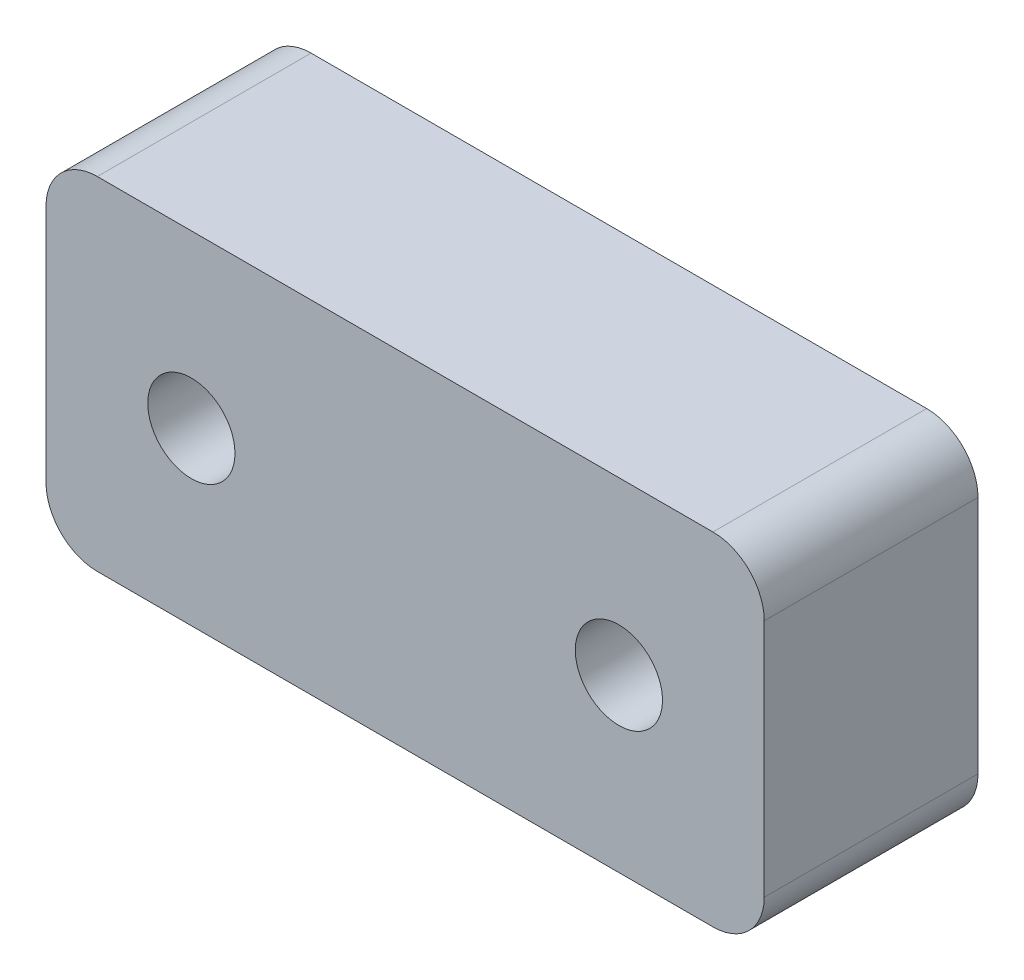
ISO-10303-21;
HEADER;
FILE_DESCRIPTION(('STEP AP214'),'2;1');
FILE_NAME('part.step','',(''),(''),'','','');
FILE_SCHEMA(('AUTOMOTIVE_DESIGN { 1 0 10303 214 1 1 1 1 }'));
ENDSEC;
DATA;
#1=APPLICATION_CONTEXT('core data for automotive mechanical design processes');
#2=APPLICATION_PROTOCOL_DEFINITION('international standard','automotive_design',2000,#1);
#3=PRODUCT_CONTEXT('',#1,'mechanical');
#4=PRODUCT('Part','Part','',(#3));
#5=PRODUCT_RELATED_PRODUCT_CATEGORY('part','',(#4));
#6=PRODUCT_DEFINITION_FORMATION('','',#4);
#7=PRODUCT_DEFINITION_CONTEXT('part definition',#1,'design');
#8=PRODUCT_DEFINITION('design','',#6,#7);
#9=PRODUCT_DEFINITION_SHAPE('','',#8);
#10=(LENGTH_UNIT() NAMED_UNIT(*) SI_UNIT(.MILLI.,.METRE.));
#11=(NAMED_UNIT(*) PLANE_ANGLE_UNIT() SI_UNIT($,.RADIAN.));
#12=(NAMED_UNIT(*) SI_UNIT($,.STERADIAN.) SOLID_ANGLE_UNIT());
#13=UNCERTAINTY_MEASURE_WITH_UNIT(LENGTH_MEASURE(1.E-05),#10,'distance_accuracy_value','');
#14=(GEOMETRIC_REPRESENTATION_CONTEXT(3) GLOBAL_UNCERTAINTY_ASSIGNED_CONTEXT((#13)) GLOBAL_UNIT_ASSIGNED_CONTEXT((#10,
#11,#12)) REPRESENTATION_CONTEXT('',''));
#15=CARTESIAN_POINT('',(0.,0.,0.));
#16=DIRECTION('',(0.,0.,1.));
#17=DIRECTION('',(1.,0.,0.));
#18=AXIS2_PLACEMENT_3D('',#15,#16,#17);
#19=CARTESIAN_POINT('',(-21.,-10.,12.5));
#20=DIRECTION('',(1.,0.,0.));
#21=DIRECTION('',(0.,0.,-1.));
#22=AXIS2_PLACEMENT_3D('',#19,#20,#21);
#23=PLANE('',#22);
#24=DIRECTION('',(0.,-1.,0.));
#25=VECTOR('',#24,1.);
#26=CARTESIAN_POINT('',(-21.,-10.,12.5));
#27=LINE('',#26,#25);
#28=CARTESIAN_POINT('',(-21.,7.,12.5));
#29=VERTEX_POINT('',#28);
#30=CARTESIAN_POINT('',(-21.,-7.,12.5));
#31=VERTEX_POINT('',#30);
#32=EDGE_CURVE('E133',#29,#31,#27,.T.);
#33=ORIENTED_EDGE('',*,*,#32,.F.);
#34=DIRECTION('',(0.,0.,-1.));
#35=VECTOR('',#34,1.);
#36=CARTESIAN_POINT('',(-21.,7.,12.5));
#37=LINE('',#36,#35);
#38=CARTESIAN_POINT('',(-21.,7.,0.));
#39=VERTEX_POINT('',#38);
#40=EDGE_CURVE('E11',#29,#39,#37,.T.);
#41=ORIENTED_EDGE('',*,*,#40,.T.);
#42=DIRECTION('',(0.,-1.,0.));
#43=VECTOR('',#42,1.);
#44=CARTESIAN_POINT('',(-21.,-10.,0.));
#45=LINE('',#44,#43);
#46=CARTESIAN_POINT('',(-21.,-7.,0.));
#47=VERTEX_POINT('',#46);
#48=EDGE_CURVE('E164',#39,#47,#45,.T.);
#49=ORIENTED_EDGE('',*,*,#48,.T.);
#50=DIRECTION('',(0.,0.,-1.));
#51=VECTOR('',#50,1.);
#52=CARTESIAN_POINT('',(-21.,-7.,12.5));
#53=LINE('',#52,#51);
#54=EDGE_CURVE('E47',#47,#31,#53,.F.);
#55=ORIENTED_EDGE('',*,*,#54,.T.);
#56=EDGE_LOOP('',(#33,#41,#49,#55));
#57=FACE_BOUND('',#56,.T.);
#58=ADVANCED_FACE('F39',(#57),#23,.F.);
#59=CARTESIAN_POINT('',(21.,-10.,12.5));
#60=DIRECTION('',(0.,1.,0.));
#61=DIRECTION('',(-1.,0.,0.));
#62=AXIS2_PLACEMENT_3D('',#59,#60,#61);
#63=PLANE('',#62);
#64=DIRECTION('',(1.,0.,0.));
#65=VECTOR('',#64,1.);
#66=CARTESIAN_POINT('',(21.,-10.,0.));
#67=LINE('',#66,#65);
#68=CARTESIAN_POINT('',(-18.,-10.,0.));
#69=VERTEX_POINT('',#68);
#70=CARTESIAN_POINT('',(18.,-10.,0.));
#71=VERTEX_POINT('',#70);
#72=EDGE_CURVE('E138',#69,#71,#67,.T.);
#73=ORIENTED_EDGE('',*,*,#72,.T.);
#74=DIRECTION('',(0.,0.,-1.));
#75=VECTOR('',#74,1.);
#76=CARTESIAN_POINT('',(18.,-10.,12.5));
#77=LINE('',#76,#75);
#78=CARTESIAN_POINT('',(18.,-10.,12.5));
#79=VERTEX_POINT('',#78);
#80=EDGE_CURVE('E54',#71,#79,#77,.F.);
#81=ORIENTED_EDGE('',*,*,#80,.T.);
#82=DIRECTION('',(1.,0.,0.));
#83=VECTOR('',#82,1.);
#84=CARTESIAN_POINT('',(21.,-10.,12.5));
#85=LINE('',#84,#83);
#86=CARTESIAN_POINT('',(-18.,-10.,12.5));
#87=VERTEX_POINT('',#86);
#88=EDGE_CURVE('E136',#87,#79,#85,.T.);
#89=ORIENTED_EDGE('',*,*,#88,.F.);
#90=DIRECTION('',(0.,0.,-1.));
#91=VECTOR('',#90,1.);
#92=CARTESIAN_POINT('',(-18.,-10.,12.5));
#93=LINE('',#92,#91);
#94=EDGE_CURVE('E156',#87,#69,#93,.T.);
#95=ORIENTED_EDGE('',*,*,#94,.T.);
#96=EDGE_LOOP('',(#73,#81,#89,#95));
#97=FACE_BOUND('',#96,.T.);
#98=ADVANCED_FACE('F171',(#97),#63,.F.);
#99=CARTESIAN_POINT('',(21.,-10.,12.5));
#100=DIRECTION('',(-1.,0.,0.));
#101=DIRECTION('',(0.,0.,1.));
#102=AXIS2_PLACEMENT_3D('',#99,#100,#101);
#103=PLANE('',#102);
#104=DIRECTION('',(0.,1.,0.));
#105=VECTOR('',#104,1.);
#106=CARTESIAN_POINT('',(21.,-10.,0.));
#107=LINE('',#106,#105);
#108=CARTESIAN_POINT('',(21.,-7.,0.));
#109=VERTEX_POINT('',#108);
#110=CARTESIAN_POINT('',(21.,7.,0.));
#111=VERTEX_POINT('',#110);
#112=EDGE_CURVE('E134',#109,#111,#107,.T.);
#113=ORIENTED_EDGE('',*,*,#112,.T.);
#114=DIRECTION('',(0.,0.,-1.));
#115=VECTOR('',#114,1.);
#116=CARTESIAN_POINT('',(21.,7.,12.5));
#117=LINE('',#116,#115);
#118=CARTESIAN_POINT('',(21.,7.,12.5));
#119=VERTEX_POINT('',#118);
#120=EDGE_CURVE('E111',#111,#119,#117,.F.);
#121=ORIENTED_EDGE('',*,*,#120,.T.);
#122=DIRECTION('',(0.,1.,0.));
#123=VECTOR('',#122,1.);
#124=CARTESIAN_POINT('',(21.,-10.,12.5));
#125=LINE('',#124,#123);
#126=CARTESIAN_POINT('',(21.,-7.,12.5));
#127=VERTEX_POINT('',#126);
#128=EDGE_CURVE('E176',#127,#119,#125,.T.);
#129=ORIENTED_EDGE('',*,*,#128,.F.);
#130=DIRECTION('',(0.,0.,-1.));
#131=VECTOR('',#130,1.);
#132=CARTESIAN_POINT('',(21.,-7.,12.5));
#133=LINE('',#132,#131);
#134=EDGE_CURVE('E116',#127,#109,#133,.T.);
#135=ORIENTED_EDGE('',*,*,#134,.T.);
#136=EDGE_LOOP('',(#113,#121,#129,#135));
#137=FACE_BOUND('',#136,.T.);
#138=ADVANCED_FACE('F218',(#137),#103,.F.);
#139=CARTESIAN_POINT('',(21.,10.,12.5));
#140=DIRECTION('',(0.,-1.,0.));
#141=DIRECTION('',(1.,0.,0.));
#142=AXIS2_PLACEMENT_3D('',#139,#140,#141);
#143=PLANE('',#142);
#144=DIRECTION('',(-1.,0.,0.));
#145=VECTOR('',#144,1.);
#146=CARTESIAN_POINT('',(21.,10.,12.5));
#147=LINE('',#146,#145);
#148=CARTESIAN_POINT('',(18.,10.,12.5));
#149=VERTEX_POINT('',#148);
#150=CARTESIAN_POINT('',(-18.,10.,12.5));
#151=VERTEX_POINT('',#150);
#152=EDGE_CURVE('E126',#149,#151,#147,.T.);
#153=ORIENTED_EDGE('',*,*,#152,.F.);
#154=DIRECTION('',(0.,0.,-1.));
#155=VECTOR('',#154,1.);
#156=CARTESIAN_POINT('',(18.,10.,12.5));
#157=LINE('',#156,#155);
#158=CARTESIAN_POINT('',(18.,10.,0.));
#159=VERTEX_POINT('',#158);
#160=EDGE_CURVE('E110',#149,#159,#157,.T.);
#161=ORIENTED_EDGE('',*,*,#160,.T.);
#162=DIRECTION('',(-1.,0.,0.));
#163=VECTOR('',#162,1.);
#164=CARTESIAN_POINT('',(21.,10.,0.));
#165=LINE('',#164,#163);
#166=CARTESIAN_POINT('',(-18.,10.,0.));
#167=VERTEX_POINT('',#166);
#168=EDGE_CURVE('E123',#159,#167,#165,.T.);
#169=ORIENTED_EDGE('',*,*,#168,.T.);
#170=DIRECTION('',(0.,0.,-1.));
#171=VECTOR('',#170,1.);
#172=CARTESIAN_POINT('',(-18.,10.,12.5));
#173=LINE('',#172,#171);
#174=EDGE_CURVE('E128',#167,#151,#173,.F.);
#175=ORIENTED_EDGE('',*,*,#174,.T.);
#176=EDGE_LOOP('',(#153,#161,#169,#175));
#177=FACE_BOUND('',#176,.T.);
#178=ADVANCED_FACE('F122',(#177),#143,.F.);
#179=CARTESIAN_POINT('',(0.,0.,12.5));
#180=DIRECTION('',(0.,0.,1.));
#181=DIRECTION('',(1.,0.,0.));
#182=AXIS2_PLACEMENT_3D('',#179,#180,#181);
#183=PLANE('',#182);
#184=CARTESIAN_POINT('',(-12.5,0.,12.5));
#185=DIRECTION('',(0.,0.,1.));
#186=DIRECTION('',(1.,0.,0.));
#187=AXIS2_PLACEMENT_3D('',#184,#185,#186);
#188=CIRCLE('',#187,2.55);
#189=CARTESIAN_POINT('',(-9.95,0.,12.5));
#190=VERTEX_POINT('',#189);
#191=EDGE_CURVE('E185',#190,#190,#188,.T.);
#192=ORIENTED_EDGE('',*,*,#191,.F.);
#193=EDGE_LOOP('',(#192));
#194=FACE_BOUND('',#193,.T.);
#195=CARTESIAN_POINT('',(12.5,0.,12.5));
#196=DIRECTION('',(0.,0.,1.));
#197=DIRECTION('',(-1.,0.,0.));
#198=AXIS2_PLACEMENT_3D('',#195,#196,#197);
#199=CIRCLE('',#198,2.55);
#200=CARTESIAN_POINT('',(9.95,0.,12.5));
#201=VERTEX_POINT('',#200);
#202=EDGE_CURVE('E182',#201,#201,#199,.T.);
#203=ORIENTED_EDGE('',*,*,#202,.F.);
#204=EDGE_LOOP('',(#203));
#205=FACE_BOUND('',#204,.T.);
#206=ORIENTED_EDGE('',*,*,#128,.T.);
#207=CARTESIAN_POINT('',(18.,7.,12.5));
#208=DIRECTION('',(0.,0.,1.));
#209=DIRECTION('',(1.,0.,0.));
#210=AXIS2_PLACEMENT_3D('',#207,#208,#209);
#211=CIRCLE('',#210,3.);
#212=EDGE_CURVE('E154',#119,#149,#211,.T.);
#213=ORIENTED_EDGE('',*,*,#212,.T.);
#214=ORIENTED_EDGE('',*,*,#152,.T.);
#215=CARTESIAN_POINT('',(-18.,7.,12.5));
#216=DIRECTION('',(0.,0.,1.));
#217=DIRECTION('',(1.,0.,0.));
#218=AXIS2_PLACEMENT_3D('',#215,#216,#217);
#219=CIRCLE('',#218,3.);
#220=EDGE_CURVE('E150',#151,#29,#219,.T.);
#221=ORIENTED_EDGE('',*,*,#220,.T.);
#222=ORIENTED_EDGE('',*,*,#32,.T.);
#223=CARTESIAN_POINT('',(-18.,-7.,12.5));
#224=DIRECTION('',(0.,0.,1.));
#225=DIRECTION('',(1.,0.,0.));
#226=AXIS2_PLACEMENT_3D('',#223,#224,#225);
#227=CIRCLE('',#226,3.);
#228=EDGE_CURVE('E61',#31,#87,#227,.T.);
#229=ORIENTED_EDGE('',*,*,#228,.T.);
#230=ORIENTED_EDGE('',*,*,#88,.T.);
#231=CARTESIAN_POINT('',(18.,-7.,12.5));
#232=DIRECTION('',(0.,0.,1.));
#233=DIRECTION('',(1.,0.,0.));
#234=AXIS2_PLACEMENT_3D('',#231,#232,#233);
#235=CIRCLE('',#234,3.);
#236=EDGE_CURVE('E152',#79,#127,#235,.T.);
#237=ORIENTED_EDGE('',*,*,#236,.T.);
#238=EDGE_LOOP('',(#206,#213,#214,#221,#222,#229,#230,#237));
#239=FACE_BOUND('',#238,.T.);
#240=ADVANCED_FACE('F167',(#194,#205,#239),#183,.T.);
#241=CARTESIAN_POINT('',(0.,0.,0.));
#242=DIRECTION('',(0.,0.,1.));
#243=DIRECTION('',(1.,0.,0.));
#244=AXIS2_PLACEMENT_3D('',#241,#242,#243);
#245=PLANE('',#244);
#246=CARTESIAN_POINT('',(-12.5,0.,0.));
#247=DIRECTION('',(0.,0.,1.));
#248=DIRECTION('',(1.,0.,0.));
#249=AXIS2_PLACEMENT_3D('',#246,#247,#248);
#250=CIRCLE('',#249,2.55);
#251=CARTESIAN_POINT('',(-9.95,0.,0.));
#252=VERTEX_POINT('',#251);
#253=EDGE_CURVE('E172',#252,#252,#250,.T.);
#254=ORIENTED_EDGE('',*,*,#253,.T.);
#255=EDGE_LOOP('',(#254));
#256=FACE_BOUND('',#255,.T.);
#257=CARTESIAN_POINT('',(12.5,0.,0.));
#258=DIRECTION('',(0.,0.,1.));
#259=DIRECTION('',(-1.,0.,0.));
#260=AXIS2_PLACEMENT_3D('',#257,#258,#259);
#261=CIRCLE('',#260,2.55);
#262=CARTESIAN_POINT('',(9.95,0.,0.));
#263=VERTEX_POINT('',#262);
#264=EDGE_CURVE('E179',#263,#263,#261,.T.);
#265=ORIENTED_EDGE('',*,*,#264,.T.);
#266=EDGE_LOOP('',(#265));
#267=FACE_BOUND('',#266,.T.);
#268=ORIENTED_EDGE('',*,*,#168,.F.);
#269=CARTESIAN_POINT('',(18.,7.,0.));
#270=DIRECTION('',(0.,0.,1.));
#271=DIRECTION('',(1.,0.,0.));
#272=AXIS2_PLACEMENT_3D('',#269,#270,#271);
#273=CIRCLE('',#272,3.);
#274=EDGE_CURVE('E106',#159,#111,#273,.F.);
#275=ORIENTED_EDGE('',*,*,#274,.T.);
#276=ORIENTED_EDGE('',*,*,#112,.F.);
#277=CARTESIAN_POINT('',(18.,-7.,0.));
#278=DIRECTION('',(0.,0.,1.));
#279=DIRECTION('',(1.,0.,0.));
#280=AXIS2_PLACEMENT_3D('',#277,#278,#279);
#281=CIRCLE('',#280,3.);
#282=EDGE_CURVE('E117',#109,#71,#281,.F.);
#283=ORIENTED_EDGE('',*,*,#282,.T.);
#284=ORIENTED_EDGE('',*,*,#72,.F.);
#285=CARTESIAN_POINT('',(-18.,-7.,0.));
#286=DIRECTION('',(0.,0.,1.));
#287=DIRECTION('',(1.,0.,0.));
#288=AXIS2_PLACEMENT_3D('',#285,#286,#287);
#289=CIRCLE('',#288,3.);
#290=EDGE_CURVE('E127',#69,#47,#289,.F.);
#291=ORIENTED_EDGE('',*,*,#290,.T.);
#292=ORIENTED_EDGE('',*,*,#48,.F.);
#293=CARTESIAN_POINT('',(-18.,7.,0.));
#294=DIRECTION('',(0.,0.,1.));
#295=DIRECTION('',(1.,0.,0.));
#296=AXIS2_PLACEMENT_3D('',#293,#294,#295);
#297=CIRCLE('',#296,3.);
#298=EDGE_CURVE('E132',#39,#167,#297,.F.);
#299=ORIENTED_EDGE('',*,*,#298,.T.);
#300=EDGE_LOOP('',(#268,#275,#276,#283,#284,#291,#292,#299));
#301=FACE_BOUND('',#300,.T.);
#302=ADVANCED_FACE('F130',(#256,#267,#301),#245,.F.);
#303=CARTESIAN_POINT('',(12.5,0.,0.));
#304=DIRECTION('',(0.,0.,1.));
#305=DIRECTION('',(1.,0.,0.));
#306=AXIS2_PLACEMENT_3D('',#303,#304,#305);
#307=CYLINDRICAL_SURFACE('',#306,2.55);
#308=ORIENTED_EDGE('',*,*,#264,.F.);
#309=EDGE_LOOP('',(#308));
#310=FACE_BOUND('',#309,.T.);
#311=ORIENTED_EDGE('',*,*,#202,.T.);
#312=EDGE_LOOP('',(#311));
#313=FACE_BOUND('',#312,.T.);
#314=ADVANCED_FACE('F196',(#310,#313),#307,.F.);
#315=CARTESIAN_POINT('',(-12.5,0.,0.));
#316=DIRECTION('',(0.,0.,1.));
#317=DIRECTION('',(1.,0.,0.));
#318=AXIS2_PLACEMENT_3D('',#315,#316,#317);
#319=CYLINDRICAL_SURFACE('',#318,2.55);
#320=ORIENTED_EDGE('',*,*,#253,.F.);
#321=EDGE_LOOP('',(#320));
#322=FACE_BOUND('',#321,.T.);
#323=ORIENTED_EDGE('',*,*,#191,.T.);
#324=EDGE_LOOP('',(#323));
#325=FACE_BOUND('',#324,.T.);
#326=ADVANCED_FACE('F193',(#322,#325),#319,.F.);
#327=CARTESIAN_POINT('',(18.,7.,12.5));
#328=DIRECTION('',(0.,0.,-1.));
#329=DIRECTION('',(-1.,0.,0.));
#330=AXIS2_PLACEMENT_3D('',#327,#328,#329);
#331=CYLINDRICAL_SURFACE('',#330,3.);
#332=ORIENTED_EDGE('',*,*,#212,.F.);
#333=ORIENTED_EDGE('',*,*,#120,.F.);
#334=ORIENTED_EDGE('',*,*,#274,.F.);
#335=ORIENTED_EDGE('',*,*,#160,.F.);
#336=EDGE_LOOP('',(#332,#333,#334,#335));
#337=FACE_BOUND('',#336,.T.);
#338=ADVANCED_FACE('F109',(#337),#331,.T.);
#339=CARTESIAN_POINT('',(18.,-7.,12.5));
#340=DIRECTION('',(0.,0.,-1.));
#341=DIRECTION('',(-1.,0.,0.));
#342=AXIS2_PLACEMENT_3D('',#339,#340,#341);
#343=CYLINDRICAL_SURFACE('',#342,3.);
#344=ORIENTED_EDGE('',*,*,#236,.F.);
#345=ORIENTED_EDGE('',*,*,#80,.F.);
#346=ORIENTED_EDGE('',*,*,#282,.F.);
#347=ORIENTED_EDGE('',*,*,#134,.F.);
#348=EDGE_LOOP('',(#344,#345,#346,#347));
#349=FACE_BOUND('',#348,.T.);
#350=ADVANCED_FACE('F224',(#349),#343,.T.);
#351=CARTESIAN_POINT('',(-18.,7.,12.5));
#352=DIRECTION('',(0.,0.,-1.));
#353=DIRECTION('',(-1.,0.,0.));
#354=AXIS2_PLACEMENT_3D('',#351,#352,#353);
#355=CYLINDRICAL_SURFACE('',#354,3.);
#356=ORIENTED_EDGE('',*,*,#220,.F.);
#357=ORIENTED_EDGE('',*,*,#174,.F.);
#358=ORIENTED_EDGE('',*,*,#298,.F.);
#359=ORIENTED_EDGE('',*,*,#40,.F.);
#360=EDGE_LOOP('',(#356,#357,#358,#359));
#361=FACE_BOUND('',#360,.T.);
#362=ADVANCED_FACE('F226',(#361),#355,.T.);
#363=CARTESIAN_POINT('',(-18.,-7.,12.5));
#364=DIRECTION('',(0.,0.,-1.));
#365=DIRECTION('',(-1.,0.,0.));
#366=AXIS2_PLACEMENT_3D('',#363,#364,#365);
#367=CYLINDRICAL_SURFACE('',#366,3.);
#368=ORIENTED_EDGE('',*,*,#228,.F.);
#369=ORIENTED_EDGE('',*,*,#54,.F.);
#370=ORIENTED_EDGE('',*,*,#290,.F.);
#371=ORIENTED_EDGE('',*,*,#94,.F.);
#372=EDGE_LOOP('',(#368,#369,#370,#371));
#373=FACE_BOUND('',#372,.T.);
#374=ADVANCED_FACE('F41',(#373),#367,.T.);
#375=CLOSED_SHELL('',(#58,#98,#138,#178,#240,#302,#314,#326,#338,#350,#362,#374));
#376=MANIFOLD_SOLID_BREP('B2',#375);
#377=ADVANCED_BREP_SHAPE_REPRESENTATION('',(#18,#376),#14);
#378=SHAPE_DEFINITION_REPRESENTATION(#9,#377);
ENDSEC;
END-ISO-10303-21;
